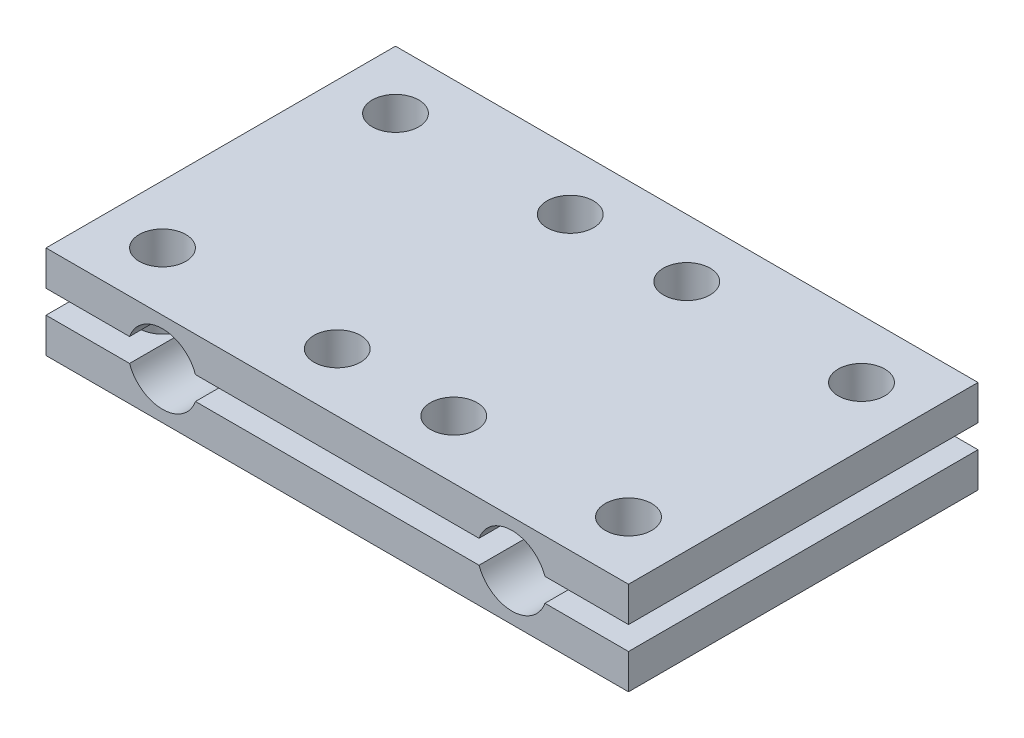
ISO-10303-21;
HEADER;
FILE_DESCRIPTION(('STEP AP214'),'2;1');
FILE_NAME('part.step','',(''),(''),'','','');
FILE_SCHEMA(('AUTOMOTIVE_DESIGN { 1 0 10303 214 1 1 1 1 }'));
ENDSEC;
DATA;
#1=APPLICATION_CONTEXT('core data for automotive mechanical design processes');
#2=APPLICATION_PROTOCOL_DEFINITION('international standard','automotive_design',2000,#1);
#3=PRODUCT_CONTEXT('',#1,'mechanical');
#4=PRODUCT('Part','Part','',(#3));
#5=PRODUCT_RELATED_PRODUCT_CATEGORY('part','',(#4));
#6=PRODUCT_DEFINITION_FORMATION('','',#4);
#7=PRODUCT_DEFINITION_CONTEXT('part definition',#1,'design');
#8=PRODUCT_DEFINITION('design','',#6,#7);
#9=PRODUCT_DEFINITION_SHAPE('','',#8);
#10=(LENGTH_UNIT() NAMED_UNIT(*) SI_UNIT(.MILLI.,.METRE.));
#11=(NAMED_UNIT(*) PLANE_ANGLE_UNIT() SI_UNIT($,.RADIAN.));
#12=(NAMED_UNIT(*) SI_UNIT($,.STERADIAN.) SOLID_ANGLE_UNIT());
#13=UNCERTAINTY_MEASURE_WITH_UNIT(LENGTH_MEASURE(1.E-05),#10,'distance_accuracy_value','');
#14=(GEOMETRIC_REPRESENTATION_CONTEXT(3) GLOBAL_UNCERTAINTY_ASSIGNED_CONTEXT((#13)) GLOBAL_UNIT_ASSIGNED_CONTEXT((#10,
#11,#12)) REPRESENTATION_CONTEXT('',''));
#15=CARTESIAN_POINT('',(0.,0.,0.));
#16=DIRECTION('',(0.,0.,1.));
#17=DIRECTION('',(1.,0.,0.));
#18=AXIS2_PLACEMENT_3D('',#15,#16,#17);
#19=CARTESIAN_POINT('',(-25.,8.,0.));
#20=DIRECTION('',(-1.,0.,0.));
#21=DIRECTION('',(0.,0.,1.));
#22=AXIS2_PLACEMENT_3D('',#19,#20,#21);
#23=PLANE('',#22);
#24=DIRECTION('',(0.,0.,1.));
#25=VECTOR('',#24,1.);
#26=CARTESIAN_POINT('',(-25.,3.,-30.));
#27=LINE('',#26,#25);
#28=CARTESIAN_POINT('',(-25.,3.,-30.));
#29=VERTEX_POINT('',#28);
#30=CARTESIAN_POINT('',(-25.,3.,0.));
#31=VERTEX_POINT('',#30);
#32=EDGE_CURVE('E227',#29,#31,#27,.T.);
#33=ORIENTED_EDGE('',*,*,#32,.F.);
#34=DIRECTION('',(0.,-1.,0.));
#35=VECTOR('',#34,1.);
#36=CARTESIAN_POINT('',(-25.,8.,-30.));
#37=LINE('',#36,#35);
#38=CARTESIAN_POINT('',(-25.,0.,-30.));
#39=VERTEX_POINT('',#38);
#40=EDGE_CURVE('E209',#29,#39,#37,.T.);
#41=ORIENTED_EDGE('',*,*,#40,.T.);
#42=DIRECTION('',(0.,0.,-1.));
#43=VECTOR('',#42,1.);
#44=CARTESIAN_POINT('',(-25.,0.,0.));
#45=LINE('',#44,#43);
#46=CARTESIAN_POINT('',(-25.,0.,0.));
#47=VERTEX_POINT('',#46);
#48=EDGE_CURVE('E264',#47,#39,#45,.T.);
#49=ORIENTED_EDGE('',*,*,#48,.F.);
#50=DIRECTION('',(0.,-1.,0.));
#51=VECTOR('',#50,1.);
#52=CARTESIAN_POINT('',(-25.,8.,0.));
#53=LINE('',#52,#51);
#54=EDGE_CURVE('E199',#31,#47,#53,.T.);
#55=ORIENTED_EDGE('',*,*,#54,.F.);
#56=EDGE_LOOP('',(#33,#41,#49,#55));
#57=FACE_BOUND('',#56,.T.);
#58=ADVANCED_FACE('F104',(#57),#23,.T.);
#59=CARTESIAN_POINT('',(0.,8.,0.));
#60=DIRECTION('',(0.,0.,1.));
#61=DIRECTION('',(1.,0.,0.));
#62=AXIS2_PLACEMENT_3D('',#59,#60,#61);
#63=PLANE('',#62);
#64=DIRECTION('',(1.,0.,0.));
#65=VECTOR('',#64,1.);
#66=CARTESIAN_POINT('',(0.,3.,0.));
#67=LINE('',#66,#65);
#68=CARTESIAN_POINT('',(17.8284271247462,3.,0.));
#69=VERTEX_POINT('',#68);
#70=CARTESIAN_POINT('',(25.,3.,0.));
#71=VERTEX_POINT('',#70);
#72=EDGE_CURVE('E220',#69,#71,#67,.T.);
#73=ORIENTED_EDGE('',*,*,#72,.F.);
#74=CARTESIAN_POINT('',(15.,4.00000000000001,0.));
#75=DIRECTION('',(0.,0.,-1.));
#76=DIRECTION('',(-1.,0.,0.));
#77=AXIS2_PLACEMENT_3D('',#74,#75,#76);
#78=CIRCLE('',#77,3.);
#79=CARTESIAN_POINT('',(12.1715728752538,3.,0.));
#80=VERTEX_POINT('',#79);
#81=EDGE_CURVE('E108',#69,#80,#78,.T.);
#82=ORIENTED_EDGE('',*,*,#81,.T.);
#83=DIRECTION('',(1.,0.,0.));
#84=VECTOR('',#83,1.);
#85=CARTESIAN_POINT('',(0.,3.,0.));
#86=LINE('',#85,#84);
#87=CARTESIAN_POINT('',(-12.1715728752538,3.,0.));
#88=VERTEX_POINT('',#87);
#89=EDGE_CURVE('E178',#88,#80,#86,.T.);
#90=ORIENTED_EDGE('',*,*,#89,.F.);
#91=CARTESIAN_POINT('',(-15.,4.,0.));
#92=DIRECTION('',(0.,0.,1.));
#93=DIRECTION('',(1.,0.,0.));
#94=AXIS2_PLACEMENT_3D('',#91,#92,#93);
#95=CIRCLE('',#94,3.);
#96=CARTESIAN_POINT('',(-17.8284271247462,3.,0.));
#97=VERTEX_POINT('',#96);
#98=EDGE_CURVE('E13',#97,#88,#95,.T.);
#99=ORIENTED_EDGE('',*,*,#98,.F.);
#100=DIRECTION('',(1.,0.,0.));
#101=VECTOR('',#100,1.);
#102=CARTESIAN_POINT('',(0.,3.,0.));
#103=LINE('',#102,#101);
#104=EDGE_CURVE('E234',#31,#97,#103,.T.);
#105=ORIENTED_EDGE('',*,*,#104,.F.);
#106=ORIENTED_EDGE('',*,*,#54,.T.);
#107=DIRECTION('',(-1.,0.,0.));
#108=VECTOR('',#107,1.);
#109=CARTESIAN_POINT('',(0.,0.,0.));
#110=LINE('',#109,#108);
#111=CARTESIAN_POINT('',(25.,0.,0.));
#112=VERTEX_POINT('',#111);
#113=EDGE_CURVE('E268',#112,#47,#110,.T.);
#114=ORIENTED_EDGE('',*,*,#113,.F.);
#115=DIRECTION('',(0.,-1.,0.));
#116=VECTOR('',#115,1.);
#117=CARTESIAN_POINT('',(25.,8.,0.));
#118=LINE('',#117,#116);
#119=EDGE_CURVE('E202',#71,#112,#118,.T.);
#120=ORIENTED_EDGE('',*,*,#119,.F.);
#121=EDGE_LOOP('',(#73,#82,#90,#99,#105,#106,#114,#120));
#122=FACE_BOUND('',#121,.T.);
#123=ADVANCED_FACE('F217',(#122),#63,.T.);
#124=CARTESIAN_POINT('',(25.,8.,0.));
#125=DIRECTION('',(-1.,0.,0.));
#126=DIRECTION('',(0.,0.,1.));
#127=AXIS2_PLACEMENT_3D('',#124,#125,#126);
#128=PLANE('',#127);
#129=DIRECTION('',(0.,-1.,0.));
#130=VECTOR('',#129,1.);
#131=CARTESIAN_POINT('',(25.,8.,-30.));
#132=LINE('',#131,#130);
#133=CARTESIAN_POINT('',(25.,3.,-30.));
#134=VERTEX_POINT('',#133);
#135=CARTESIAN_POINT('',(25.,0.,-30.));
#136=VERTEX_POINT('',#135);
#137=EDGE_CURVE('E205',#134,#136,#132,.T.);
#138=ORIENTED_EDGE('',*,*,#137,.F.);
#139=DIRECTION('',(0.,0.,1.));
#140=VECTOR('',#139,1.);
#141=CARTESIAN_POINT('',(25.,3.,-30.));
#142=LINE('',#141,#140);
#143=EDGE_CURVE('E201',#134,#71,#142,.T.);
#144=ORIENTED_EDGE('',*,*,#143,.T.);
#145=ORIENTED_EDGE('',*,*,#119,.T.);
#146=DIRECTION('',(0.,0.,-1.));
#147=VECTOR('',#146,1.);
#148=CARTESIAN_POINT('',(25.,0.,0.));
#149=LINE('',#148,#147);
#150=EDGE_CURVE('E204',#112,#136,#149,.T.);
#151=ORIENTED_EDGE('',*,*,#150,.T.);
#152=EDGE_LOOP('',(#138,#144,#145,#151));
#153=FACE_BOUND('',#152,.T.);
#154=ADVANCED_FACE('F312',(#153),#128,.F.);
#155=CARTESIAN_POINT('',(20.,8.,-5.));
#156=DIRECTION('',(0.,-1.,0.));
#157=DIRECTION('',(0.,0.,-1.));
#158=AXIS2_PLACEMENT_3D('',#155,#156,#157);
#159=CYLINDRICAL_SURFACE('',#158,2.);
#160=CARTESIAN_POINT('',(20.,3.,-5.));
#161=DIRECTION('',(0.,-1.,0.));
#162=DIRECTION('',(0.,0.,-1.));
#163=AXIS2_PLACEMENT_3D('',#160,#161,#162);
#164=CIRCLE('',#163,2.);
#165=CARTESIAN_POINT('',(20.,3.,-7.));
#166=VERTEX_POINT('',#165);
#167=EDGE_CURVE('E223',#166,#166,#164,.T.);
#168=ORIENTED_EDGE('',*,*,#167,.F.);
#169=EDGE_LOOP('',(#168));
#170=FACE_BOUND('',#169,.T.);
#171=CARTESIAN_POINT('',(20.,0.,-5.));
#172=DIRECTION('',(0.,1.,0.));
#173=DIRECTION('',(0.,0.,1.));
#174=AXIS2_PLACEMENT_3D('',#171,#172,#173);
#175=CIRCLE('',#174,2.);
#176=CARTESIAN_POINT('',(20.,0.,-2.99999999999999));
#177=VERTEX_POINT('',#176);
#178=EDGE_CURVE('E248',#177,#177,#175,.T.);
#179=ORIENTED_EDGE('',*,*,#178,.F.);
#180=EDGE_LOOP('',(#179));
#181=FACE_BOUND('',#180,.T.);
#182=ADVANCED_FACE('F340',(#170,#181),#159,.F.);
#183=CARTESIAN_POINT('',(5.,8.,-25.));
#184=DIRECTION('',(0.,-1.,0.));
#185=DIRECTION('',(0.,0.,-1.));
#186=AXIS2_PLACEMENT_3D('',#183,#184,#185);
#187=CYLINDRICAL_SURFACE('',#186,2.);
#188=CARTESIAN_POINT('',(5.,3.,-25.));
#189=DIRECTION('',(0.,-1.,0.));
#190=DIRECTION('',(0.,0.,-1.));
#191=AXIS2_PLACEMENT_3D('',#188,#189,#190);
#192=CIRCLE('',#191,2.);
#193=CARTESIAN_POINT('',(5.,3.,-27.));
#194=VERTEX_POINT('',#193);
#195=EDGE_CURVE('E243',#194,#194,#192,.T.);
#196=ORIENTED_EDGE('',*,*,#195,.F.);
#197=EDGE_LOOP('',(#196));
#198=FACE_BOUND('',#197,.T.);
#199=CARTESIAN_POINT('',(5.,0.,-25.));
#200=DIRECTION('',(0.,1.,0.));
#201=DIRECTION('',(0.,0.,1.));
#202=AXIS2_PLACEMENT_3D('',#199,#200,#201);
#203=CIRCLE('',#202,2.);
#204=CARTESIAN_POINT('',(5.,0.,-23.));
#205=VERTEX_POINT('',#204);
#206=EDGE_CURVE('E277',#205,#205,#203,.T.);
#207=ORIENTED_EDGE('',*,*,#206,.F.);
#208=EDGE_LOOP('',(#207));
#209=FACE_BOUND('',#208,.T.);
#210=ADVANCED_FACE('F344',(#198,#209),#187,.F.);
#211=CARTESIAN_POINT('',(5.,8.,-5.));
#212=DIRECTION('',(0.,-1.,0.));
#213=DIRECTION('',(0.,0.,-1.));
#214=AXIS2_PLACEMENT_3D('',#211,#212,#213);
#215=CYLINDRICAL_SURFACE('',#214,2.);
#216=CARTESIAN_POINT('',(5.,3.,-5.));
#217=DIRECTION('',(0.,-1.,0.));
#218=DIRECTION('',(0.,0.,-1.));
#219=AXIS2_PLACEMENT_3D('',#216,#217,#218);
#220=CIRCLE('',#219,2.);
#221=CARTESIAN_POINT('',(5.,3.,-7.));
#222=VERTEX_POINT('',#221);
#223=EDGE_CURVE('E255',#222,#222,#220,.F.);
#224=ORIENTED_EDGE('',*,*,#223,.T.);
#225=EDGE_LOOP('',(#224));
#226=FACE_BOUND('',#225,.T.);
#227=CARTESIAN_POINT('',(5.,0.,-5.));
#228=DIRECTION('',(0.,1.,0.));
#229=DIRECTION('',(0.,0.,1.));
#230=AXIS2_PLACEMENT_3D('',#227,#228,#229);
#231=CIRCLE('',#230,2.);
#232=CARTESIAN_POINT('',(5.,0.,-3.));
#233=VERTEX_POINT('',#232);
#234=EDGE_CURVE('E254',#233,#233,#231,.F.);
#235=ORIENTED_EDGE('',*,*,#234,.T.);
#236=EDGE_LOOP('',(#235));
#237=FACE_BOUND('',#236,.T.);
#238=ADVANCED_FACE('F357',(#226,#237),#215,.F.);
#239=CARTESIAN_POINT('',(-5.,8.,-25.));
#240=DIRECTION('',(0.,-1.,0.));
#241=DIRECTION('',(0.,0.,-1.));
#242=AXIS2_PLACEMENT_3D('',#239,#240,#241);
#243=CYLINDRICAL_SURFACE('',#242,2.);
#244=CARTESIAN_POINT('',(-5.,3.,-25.));
#245=DIRECTION('',(0.,-1.,0.));
#246=DIRECTION('',(0.,0.,-1.));
#247=AXIS2_PLACEMENT_3D('',#244,#245,#246);
#248=CIRCLE('',#247,2.);
#249=CARTESIAN_POINT('',(-5.,3.,-27.));
#250=VERTEX_POINT('',#249);
#251=EDGE_CURVE('E251',#250,#250,#248,.F.);
#252=ORIENTED_EDGE('',*,*,#251,.T.);
#253=EDGE_LOOP('',(#252));
#254=FACE_BOUND('',#253,.T.);
#255=CARTESIAN_POINT('',(-5.,0.,-25.));
#256=DIRECTION('',(0.,1.,0.));
#257=DIRECTION('',(0.,0.,1.));
#258=AXIS2_PLACEMENT_3D('',#255,#256,#257);
#259=CIRCLE('',#258,2.);
#260=CARTESIAN_POINT('',(-5.,0.,-23.));
#261=VERTEX_POINT('',#260);
#262=EDGE_CURVE('E232',#261,#261,#259,.F.);
#263=ORIENTED_EDGE('',*,*,#262,.T.);
#264=EDGE_LOOP('',(#263));
#265=FACE_BOUND('',#264,.T.);
#266=ADVANCED_FACE('F353',(#254,#265),#243,.F.);
#267=CARTESIAN_POINT('',(-5.,8.,-5.));
#268=DIRECTION('',(0.,-1.,0.));
#269=DIRECTION('',(0.,0.,-1.));
#270=AXIS2_PLACEMENT_3D('',#267,#268,#269);
#271=CYLINDRICAL_SURFACE('',#270,2.);
#272=CARTESIAN_POINT('',(-5.,3.,-5.));
#273=DIRECTION('',(0.,-1.,0.));
#274=DIRECTION('',(0.,0.,-1.));
#275=AXIS2_PLACEMENT_3D('',#272,#273,#274);
#276=CIRCLE('',#275,2.);
#277=CARTESIAN_POINT('',(-5.,3.,-7.));
#278=VERTEX_POINT('',#277);
#279=EDGE_CURVE('E241',#278,#278,#276,.T.);
#280=ORIENTED_EDGE('',*,*,#279,.F.);
#281=EDGE_LOOP('',(#280));
#282=FACE_BOUND('',#281,.T.);
#283=CARTESIAN_POINT('',(-5.,0.,-5.));
#284=DIRECTION('',(0.,1.,0.));
#285=DIRECTION('',(0.,0.,1.));
#286=AXIS2_PLACEMENT_3D('',#283,#284,#285);
#287=CIRCLE('',#286,2.);
#288=CARTESIAN_POINT('',(-5.,0.,-3.));
#289=VERTEX_POINT('',#288);
#290=EDGE_CURVE('E271',#289,#289,#287,.T.);
#291=ORIENTED_EDGE('',*,*,#290,.F.);
#292=EDGE_LOOP('',(#291));
#293=FACE_BOUND('',#292,.T.);
#294=ADVANCED_FACE('F350',(#282,#293),#271,.F.);
#295=CARTESIAN_POINT('',(0.,8.,-30.));
#296=DIRECTION('',(0.,0.,1.));
#297=DIRECTION('',(1.,0.,0.));
#298=AXIS2_PLACEMENT_3D('',#295,#296,#297);
#299=PLANE('',#298);
#300=CARTESIAN_POINT('',(15.,4.00000000000001,-30.));
#301=DIRECTION('',(0.,0.,-1.));
#302=DIRECTION('',(-1.,0.,0.));
#303=AXIS2_PLACEMENT_3D('',#300,#301,#302);
#304=CIRCLE('',#303,3.);
#305=CARTESIAN_POINT('',(17.8284271247462,3.,-30.));
#306=VERTEX_POINT('',#305);
#307=CARTESIAN_POINT('',(12.1715728752538,3.,-30.));
#308=VERTEX_POINT('',#307);
#309=EDGE_CURVE('E180',#306,#308,#304,.T.);
#310=ORIENTED_EDGE('',*,*,#309,.F.);
#311=DIRECTION('',(1.,0.,0.));
#312=VECTOR('',#311,1.);
#313=CARTESIAN_POINT('',(0.,3.,-30.));
#314=LINE('',#313,#312);
#315=EDGE_CURVE('E208',#306,#134,#314,.T.);
#316=ORIENTED_EDGE('',*,*,#315,.T.);
#317=ORIENTED_EDGE('',*,*,#137,.T.);
#318=DIRECTION('',(-1.,0.,0.));
#319=VECTOR('',#318,1.);
#320=CARTESIAN_POINT('',(0.,0.,-30.));
#321=LINE('',#320,#319);
#322=EDGE_CURVE('E207',#136,#39,#321,.T.);
#323=ORIENTED_EDGE('',*,*,#322,.T.);
#324=ORIENTED_EDGE('',*,*,#40,.F.);
#325=DIRECTION('',(1.,0.,0.));
#326=VECTOR('',#325,1.);
#327=CARTESIAN_POINT('',(0.,3.,-30.));
#328=LINE('',#327,#326);
#329=CARTESIAN_POINT('',(-17.8284271247462,3.,-30.));
#330=VERTEX_POINT('',#329);
#331=EDGE_CURVE('E194',#29,#330,#328,.T.);
#332=ORIENTED_EDGE('',*,*,#331,.T.);
#333=CARTESIAN_POINT('',(-15.,4.,-30.));
#334=DIRECTION('',(0.,0.,1.));
#335=DIRECTION('',(1.,0.,0.));
#336=AXIS2_PLACEMENT_3D('',#333,#334,#335);
#337=CIRCLE('',#336,3.);
#338=CARTESIAN_POINT('',(-12.1715728752538,3.,-30.));
#339=VERTEX_POINT('',#338);
#340=EDGE_CURVE('E188',#330,#339,#337,.T.);
#341=ORIENTED_EDGE('',*,*,#340,.T.);
#342=DIRECTION('',(1.,0.,0.));
#343=VECTOR('',#342,1.);
#344=CARTESIAN_POINT('',(0.,3.,-30.));
#345=LINE('',#344,#343);
#346=EDGE_CURVE('E173',#339,#308,#345,.T.);
#347=ORIENTED_EDGE('',*,*,#346,.T.);
#348=EDGE_LOOP('',(#310,#316,#317,#323,#324,#332,#341,#347));
#349=FACE_BOUND('',#348,.T.);
#350=ADVANCED_FACE('F186',(#349),#299,.F.);
#351=CARTESIAN_POINT('',(-20.,8.,-25.));
#352=DIRECTION('',(0.,-1.,0.));
#353=DIRECTION('',(0.,0.,-1.));
#354=AXIS2_PLACEMENT_3D('',#351,#352,#353);
#355=CYLINDRICAL_SURFACE('',#354,2.00000000000001);
#356=CARTESIAN_POINT('',(-20.,3.,-25.));
#357=DIRECTION('',(0.,-1.,0.));
#358=DIRECTION('',(0.,0.,-1.));
#359=AXIS2_PLACEMENT_3D('',#356,#357,#358);
#360=CIRCLE('',#359,2.00000000000001);
#361=CARTESIAN_POINT('',(-20.,3.,-27.));
#362=VERTEX_POINT('',#361);
#363=EDGE_CURVE('E237',#362,#362,#360,.T.);
#364=ORIENTED_EDGE('',*,*,#363,.F.);
#365=EDGE_LOOP('',(#364));
#366=FACE_BOUND('',#365,.T.);
#367=CARTESIAN_POINT('',(-20.,0.,-25.));
#368=DIRECTION('',(0.,1.,0.));
#369=DIRECTION('',(0.,0.,1.));
#370=AXIS2_PLACEMENT_3D('',#367,#368,#369);
#371=CIRCLE('',#370,2.00000000000001);
#372=CARTESIAN_POINT('',(-20.,0.,-23.));
#373=VERTEX_POINT('',#372);
#374=EDGE_CURVE('E261',#373,#373,#371,.T.);
#375=ORIENTED_EDGE('',*,*,#374,.F.);
#376=EDGE_LOOP('',(#375));
#377=FACE_BOUND('',#376,.T.);
#378=ADVANCED_FACE('F316',(#366,#377),#355,.F.);
#379=CARTESIAN_POINT('',(-20.,8.,-5.));
#380=DIRECTION('',(0.,-1.,0.));
#381=DIRECTION('',(0.,0.,-1.));
#382=AXIS2_PLACEMENT_3D('',#379,#380,#381);
#383=CYLINDRICAL_SURFACE('',#382,2.);
#384=CARTESIAN_POINT('',(-20.,3.,-5.));
#385=DIRECTION('',(0.,-1.,0.));
#386=DIRECTION('',(0.,0.,-1.));
#387=AXIS2_PLACEMENT_3D('',#384,#385,#386);
#388=CIRCLE('',#387,2.);
#389=CARTESIAN_POINT('',(-20.,3.,-7.));
#390=VERTEX_POINT('',#389);
#391=EDGE_CURVE('E189',#390,#390,#388,.F.);
#392=ORIENTED_EDGE('',*,*,#391,.T.);
#393=EDGE_LOOP('',(#392));
#394=FACE_BOUND('',#393,.T.);
#395=CARTESIAN_POINT('',(-20.,0.,-5.));
#396=DIRECTION('',(0.,1.,0.));
#397=DIRECTION('',(0.,0.,1.));
#398=AXIS2_PLACEMENT_3D('',#395,#396,#397);
#399=CIRCLE('',#398,2.);
#400=CARTESIAN_POINT('',(-20.,0.,-2.99999999999999));
#401=VERTEX_POINT('',#400);
#402=EDGE_CURVE('E192',#401,#401,#399,.F.);
#403=ORIENTED_EDGE('',*,*,#402,.T.);
#404=EDGE_LOOP('',(#403));
#405=FACE_BOUND('',#404,.T.);
#406=ADVANCED_FACE('F319',(#394,#405),#383,.F.);
#407=CARTESIAN_POINT('',(20.,8.,-25.));
#408=DIRECTION('',(0.,-1.,0.));
#409=DIRECTION('',(0.,0.,-1.));
#410=AXIS2_PLACEMENT_3D('',#407,#408,#409);
#411=CYLINDRICAL_SURFACE('',#410,2.00000000000001);
#412=CARTESIAN_POINT('',(20.,3.,-25.));
#413=DIRECTION('',(0.,-1.,0.));
#414=DIRECTION('',(0.,0.,-1.));
#415=AXIS2_PLACEMENT_3D('',#412,#413,#414);
#416=CIRCLE('',#415,2.00000000000001);
#417=CARTESIAN_POINT('',(20.,3.,-27.));
#418=VERTEX_POINT('',#417);
#419=EDGE_CURVE('E260',#418,#418,#416,.F.);
#420=ORIENTED_EDGE('',*,*,#419,.T.);
#421=EDGE_LOOP('',(#420));
#422=FACE_BOUND('',#421,.T.);
#423=CARTESIAN_POINT('',(20.,0.,-25.));
#424=DIRECTION('',(0.,1.,0.));
#425=DIRECTION('',(0.,0.,1.));
#426=AXIS2_PLACEMENT_3D('',#423,#424,#425);
#427=CIRCLE('',#426,2.00000000000001);
#428=CARTESIAN_POINT('',(20.,0.,-23.));
#429=VERTEX_POINT('',#428);
#430=EDGE_CURVE('E265',#429,#429,#427,.F.);
#431=ORIENTED_EDGE('',*,*,#430,.T.);
#432=EDGE_LOOP('',(#431));
#433=FACE_BOUND('',#432,.T.);
#434=ADVANCED_FACE('F291',(#422,#433),#411,.F.);
#435=CARTESIAN_POINT('',(0.,0.,0.));
#436=DIRECTION('',(0.,1.,0.));
#437=DIRECTION('',(0.,0.,1.));
#438=AXIS2_PLACEMENT_3D('',#435,#436,#437);
#439=PLANE('',#438);
#440=ORIENTED_EDGE('',*,*,#402,.F.);
#441=EDGE_LOOP('',(#440));
#442=FACE_BOUND('',#441,.T.);
#443=ORIENTED_EDGE('',*,*,#374,.T.);
#444=EDGE_LOOP('',(#443));
#445=FACE_BOUND('',#444,.T.);
#446=ORIENTED_EDGE('',*,*,#48,.T.);
#447=ORIENTED_EDGE('',*,*,#322,.F.);
#448=ORIENTED_EDGE('',*,*,#150,.F.);
#449=ORIENTED_EDGE('',*,*,#113,.T.);
#450=EDGE_LOOP('',(#446,#447,#448,#449));
#451=FACE_BOUND('',#450,.T.);
#452=ORIENTED_EDGE('',*,*,#290,.T.);
#453=EDGE_LOOP('',(#452));
#454=FACE_BOUND('',#453,.T.);
#455=ORIENTED_EDGE('',*,*,#262,.F.);
#456=EDGE_LOOP('',(#455));
#457=FACE_BOUND('',#456,.T.);
#458=ORIENTED_EDGE('',*,*,#234,.F.);
#459=EDGE_LOOP('',(#458));
#460=FACE_BOUND('',#459,.T.);
#461=ORIENTED_EDGE('',*,*,#206,.T.);
#462=EDGE_LOOP('',(#461));
#463=FACE_BOUND('',#462,.T.);
#464=ORIENTED_EDGE('',*,*,#178,.T.);
#465=EDGE_LOOP('',(#464));
#466=FACE_BOUND('',#465,.T.);
#467=ORIENTED_EDGE('',*,*,#430,.F.);
#468=EDGE_LOOP('',(#467));
#469=FACE_BOUND('',#468,.T.);
#470=ADVANCED_FACE('F325',(#442,#445,#451,#454,#457,#460,#463,#466,#469),#439,.F.);
#471=CARTESIAN_POINT('',(0.,3.,-30.));
#472=DIRECTION('',(0.,-1.,0.));
#473=DIRECTION('',(0.,0.,-1.));
#474=AXIS2_PLACEMENT_3D('',#471,#472,#473);
#475=PLANE('',#474);
#476=ORIENTED_EDGE('',*,*,#195,.T.);
#477=EDGE_LOOP('',(#476));
#478=FACE_BOUND('',#477,.T.);
#479=ORIENTED_EDGE('',*,*,#251,.F.);
#480=EDGE_LOOP('',(#479));
#481=FACE_BOUND('',#480,.T.);
#482=ORIENTED_EDGE('',*,*,#279,.T.);
#483=EDGE_LOOP('',(#482));
#484=FACE_BOUND('',#483,.T.);
#485=ORIENTED_EDGE('',*,*,#89,.T.);
#486=DIRECTION('',(0.,0.,1.));
#487=VECTOR('',#486,1.);
#488=CARTESIAN_POINT('',(12.1715728752538,3.,-30.));
#489=LINE('',#488,#487);
#490=EDGE_CURVE('E146',#308,#80,#489,.T.);
#491=ORIENTED_EDGE('',*,*,#490,.F.);
#492=ORIENTED_EDGE('',*,*,#346,.F.);
#493=DIRECTION('',(0.,0.,1.));
#494=VECTOR('',#493,1.);
#495=CARTESIAN_POINT('',(-12.1715728752538,3.,-30.));
#496=LINE('',#495,#494);
#497=EDGE_CURVE('E238',#339,#88,#496,.T.);
#498=ORIENTED_EDGE('',*,*,#497,.T.);
#499=EDGE_LOOP('',(#485,#491,#492,#498));
#500=FACE_BOUND('',#499,.T.);
#501=ORIENTED_EDGE('',*,*,#223,.F.);
#502=EDGE_LOOP('',(#501));
#503=FACE_BOUND('',#502,.T.);
#504=ADVANCED_FACE('F175',(#478,#481,#484,#500,#503),#475,.F.);
#505=CARTESIAN_POINT('',(0.,3.,-30.));
#506=DIRECTION('',(0.,-1.,0.));
#507=DIRECTION('',(0.,0.,-1.));
#508=AXIS2_PLACEMENT_3D('',#505,#506,#507);
#509=PLANE('',#508);
#510=ORIENTED_EDGE('',*,*,#363,.T.);
#511=EDGE_LOOP('',(#510));
#512=FACE_BOUND('',#511,.T.);
#513=ORIENTED_EDGE('',*,*,#104,.T.);
#514=DIRECTION('',(0.,0.,1.));
#515=VECTOR('',#514,1.);
#516=CARTESIAN_POINT('',(-17.8284271247462,3.,-30.));
#517=LINE('',#516,#515);
#518=EDGE_CURVE('E114',#330,#97,#517,.T.);
#519=ORIENTED_EDGE('',*,*,#518,.F.);
#520=ORIENTED_EDGE('',*,*,#331,.F.);
#521=ORIENTED_EDGE('',*,*,#32,.T.);
#522=EDGE_LOOP('',(#513,#519,#520,#521));
#523=FACE_BOUND('',#522,.T.);
#524=ORIENTED_EDGE('',*,*,#391,.F.);
#525=EDGE_LOOP('',(#524));
#526=FACE_BOUND('',#525,.T.);
#527=ADVANCED_FACE('F296',(#512,#523,#526),#509,.F.);
#528=CARTESIAN_POINT('',(0.,3.,-30.));
#529=DIRECTION('',(0.,-1.,0.));
#530=DIRECTION('',(0.,0.,-1.));
#531=AXIS2_PLACEMENT_3D('',#528,#529,#530);
#532=PLANE('',#531);
#533=ORIENTED_EDGE('',*,*,#167,.T.);
#534=EDGE_LOOP('',(#533));
#535=FACE_BOUND('',#534,.T.);
#536=ORIENTED_EDGE('',*,*,#72,.T.);
#537=ORIENTED_EDGE('',*,*,#143,.F.);
#538=ORIENTED_EDGE('',*,*,#315,.F.);
#539=DIRECTION('',(0.,0.,1.));
#540=VECTOR('',#539,1.);
#541=CARTESIAN_POINT('',(17.8284271247462,3.,-30.));
#542=LINE('',#541,#540);
#543=EDGE_CURVE('E154',#306,#69,#542,.T.);
#544=ORIENTED_EDGE('',*,*,#543,.T.);
#545=EDGE_LOOP('',(#536,#537,#538,#544));
#546=FACE_BOUND('',#545,.T.);
#547=ORIENTED_EDGE('',*,*,#419,.F.);
#548=EDGE_LOOP('',(#547));
#549=FACE_BOUND('',#548,.T.);
#550=ADVANCED_FACE('F294',(#535,#546,#549),#532,.F.);
#551=CARTESIAN_POINT('',(15.,4.00000000000001,-30.));
#552=DIRECTION('',(0.,0.,1.));
#553=DIRECTION('',(1.,0.,0.));
#554=AXIS2_PLACEMENT_3D('',#551,#552,#553);
#555=CYLINDRICAL_SURFACE('',#554,3.);
#556=ORIENTED_EDGE('',*,*,#490,.T.);
#557=ORIENTED_EDGE('',*,*,#81,.F.);
#558=ORIENTED_EDGE('',*,*,#543,.F.);
#559=ORIENTED_EDGE('',*,*,#309,.T.);
#560=EDGE_LOOP('',(#556,#557,#558,#559));
#561=FACE_BOUND('',#560,.T.);
#562=ADVANCED_FACE('F106',(#561),#555,.F.);
#563=CARTESIAN_POINT('',(-15.,4.,-30.));
#564=DIRECTION('',(0.,0.,1.));
#565=DIRECTION('',(1.,0.,0.));
#566=AXIS2_PLACEMENT_3D('',#563,#564,#565);
#567=CYLINDRICAL_SURFACE('',#566,3.);
#568=ORIENTED_EDGE('',*,*,#340,.F.);
#569=ORIENTED_EDGE('',*,*,#518,.T.);
#570=ORIENTED_EDGE('',*,*,#98,.T.);
#571=ORIENTED_EDGE('',*,*,#497,.F.);
#572=EDGE_LOOP('',(#568,#569,#570,#571));
#573=FACE_BOUND('',#572,.T.);
#574=ADVANCED_FACE('F303',(#573),#567,.F.);
#575=CLOSED_SHELL('',(#58,#123,#154,#182,#210,#238,#266,#294,#350,#378,#406,#434,#470,#504,#527,
#550,#562,#574));
#576=MANIFOLD_SOLID_BREP('B2',#575);
#577=CARTESIAN_POINT('',(20.,8.,-5.));
#578=DIRECTION('',(0.,-1.,0.));
#579=DIRECTION('',(0.,0.,-1.));
#580=AXIS2_PLACEMENT_3D('',#577,#578,#579);
#581=CYLINDRICAL_SURFACE('',#580,2.);
#582=CARTESIAN_POINT('',(20.,8.,-5.));
#583=DIRECTION('',(0.,1.,0.));
#584=DIRECTION('',(0.,0.,1.));
#585=AXIS2_PLACEMENT_3D('',#582,#583,#584);
#586=CIRCLE('',#585,2.);
#587=CARTESIAN_POINT('',(20.,8.,-2.99999999999999));
#588=VERTEX_POINT('',#587);
#589=EDGE_CURVE('E655',#588,#588,#586,.T.);
#590=ORIENTED_EDGE('',*,*,#589,.T.);
#591=EDGE_LOOP('',(#590));
#592=FACE_BOUND('',#591,.T.);
#593=CARTESIAN_POINT('',(20.,5.,-5.));
#594=DIRECTION('',(0.,-1.,0.));
#595=DIRECTION('',(0.,0.,-1.));
#596=AXIS2_PLACEMENT_3D('',#593,#594,#595);
#597=CIRCLE('',#596,2.);
#598=CARTESIAN_POINT('',(20.,5.,-7.));
#599=VERTEX_POINT('',#598);
#600=EDGE_CURVE('E609',#599,#599,#597,.T.);
#601=ORIENTED_EDGE('',*,*,#600,.T.);
#602=EDGE_LOOP('',(#601));
#603=FACE_BOUND('',#602,.T.);
#604=ADVANCED_FACE('F508',(#592,#603),#581,.F.);
#605=CARTESIAN_POINT('',(5.,8.,-25.));
#606=DIRECTION('',(0.,-1.,0.));
#607=DIRECTION('',(0.,0.,-1.));
#608=AXIS2_PLACEMENT_3D('',#605,#606,#607);
#609=CYLINDRICAL_SURFACE('',#608,2.);
#610=CARTESIAN_POINT('',(5.,8.,-25.));
#611=DIRECTION('',(0.,1.,0.));
#612=DIRECTION('',(0.,0.,1.));
#613=AXIS2_PLACEMENT_3D('',#610,#611,#612);
#614=CIRCLE('',#613,2.);
#615=CARTESIAN_POINT('',(5.,8.,-23.));
#616=VERTEX_POINT('',#615);
#617=EDGE_CURVE('E652',#616,#616,#614,.T.);
#618=ORIENTED_EDGE('',*,*,#617,.T.);
#619=EDGE_LOOP('',(#618));
#620=FACE_BOUND('',#619,.T.);
#621=CARTESIAN_POINT('',(5.,5.,-25.));
#622=DIRECTION('',(0.,-1.,0.));
#623=DIRECTION('',(0.,0.,-1.));
#624=AXIS2_PLACEMENT_3D('',#621,#622,#623);
#625=CIRCLE('',#624,2.);
#626=CARTESIAN_POINT('',(5.,5.,-27.));
#627=VERTEX_POINT('',#626);
#628=EDGE_CURVE('E625',#627,#627,#625,.T.);
#629=ORIENTED_EDGE('',*,*,#628,.T.);
#630=EDGE_LOOP('',(#629));
#631=FACE_BOUND('',#630,.T.);
#632=ADVANCED_FACE('F721',(#620,#631),#609,.F.);
#633=CARTESIAN_POINT('',(5.,8.,-5.));
#634=DIRECTION('',(0.,-1.,0.));
#635=DIRECTION('',(0.,0.,-1.));
#636=AXIS2_PLACEMENT_3D('',#633,#634,#635);
#637=CYLINDRICAL_SURFACE('',#636,2.);
#638=CARTESIAN_POINT('',(5.,8.,-5.));
#639=DIRECTION('',(0.,1.,0.));
#640=DIRECTION('',(0.,0.,1.));
#641=AXIS2_PLACEMENT_3D('',#638,#639,#640);
#642=CIRCLE('',#641,2.);
#643=CARTESIAN_POINT('',(5.,8.,-3.));
#644=VERTEX_POINT('',#643);
#645=EDGE_CURVE('E649',#644,#644,#642,.F.);
#646=ORIENTED_EDGE('',*,*,#645,.F.);
#647=EDGE_LOOP('',(#646));
#648=FACE_BOUND('',#647,.T.);
#649=CARTESIAN_POINT('',(5.,5.,-5.));
#650=DIRECTION('',(0.,-1.,0.));
#651=DIRECTION('',(0.,0.,-1.));
#652=AXIS2_PLACEMENT_3D('',#649,#650,#651);
#653=CIRCLE('',#652,2.);
#654=CARTESIAN_POINT('',(5.,5.,-7.));
#655=VERTEX_POINT('',#654);
#656=EDGE_CURVE('E622',#655,#655,#653,.F.);
#657=ORIENTED_EDGE('',*,*,#656,.F.);
#658=EDGE_LOOP('',(#657));
#659=FACE_BOUND('',#658,.T.);
#660=ADVANCED_FACE('F727',(#648,#659),#637,.F.);
#661=CARTESIAN_POINT('',(-5.,8.,-25.));
#662=DIRECTION('',(0.,-1.,0.));
#663=DIRECTION('',(0.,0.,-1.));
#664=AXIS2_PLACEMENT_3D('',#661,#662,#663);
#665=CYLINDRICAL_SURFACE('',#664,2.);
#666=CARTESIAN_POINT('',(-5.,8.,-25.));
#667=DIRECTION('',(0.,1.,0.));
#668=DIRECTION('',(0.,0.,1.));
#669=AXIS2_PLACEMENT_3D('',#666,#667,#668);
#670=CIRCLE('',#669,2.);
#671=CARTESIAN_POINT('',(-5.,8.,-23.));
#672=VERTEX_POINT('',#671);
#673=EDGE_CURVE('E646',#672,#672,#670,.F.);
#674=ORIENTED_EDGE('',*,*,#673,.F.);
#675=EDGE_LOOP('',(#674));
#676=FACE_BOUND('',#675,.T.);
#677=CARTESIAN_POINT('',(-5.,5.,-25.));
#678=DIRECTION('',(0.,-1.,0.));
#679=DIRECTION('',(0.,0.,-1.));
#680=AXIS2_PLACEMENT_3D('',#677,#678,#679);
#681=CIRCLE('',#680,2.);
#682=CARTESIAN_POINT('',(-5.,5.,-27.));
#683=VERTEX_POINT('',#682);
#684=EDGE_CURVE('E619',#683,#683,#681,.F.);
#685=ORIENTED_EDGE('',*,*,#684,.F.);
#686=EDGE_LOOP('',(#685));
#687=FACE_BOUND('',#686,.T.);
#688=ADVANCED_FACE('F737',(#676,#687),#665,.F.);
#689=CARTESIAN_POINT('',(-5.,8.,-5.));
#690=DIRECTION('',(0.,-1.,0.));
#691=DIRECTION('',(0.,0.,-1.));
#692=AXIS2_PLACEMENT_3D('',#689,#690,#691);
#693=CYLINDRICAL_SURFACE('',#692,2.);
#694=CARTESIAN_POINT('',(-5.,8.,-5.));
#695=DIRECTION('',(0.,1.,0.));
#696=DIRECTION('',(0.,0.,1.));
#697=AXIS2_PLACEMENT_3D('',#694,#695,#696);
#698=CIRCLE('',#697,2.);
#699=CARTESIAN_POINT('',(-5.,8.,-3.));
#700=VERTEX_POINT('',#699);
#701=EDGE_CURVE('E643',#700,#700,#698,.T.);
#702=ORIENTED_EDGE('',*,*,#701,.T.);
#703=EDGE_LOOP('',(#702));
#704=FACE_BOUND('',#703,.T.);
#705=CARTESIAN_POINT('',(-5.,5.,-5.));
#706=DIRECTION('',(0.,-1.,0.));
#707=DIRECTION('',(0.,0.,-1.));
#708=AXIS2_PLACEMENT_3D('',#705,#706,#707);
#709=CIRCLE('',#708,2.);
#710=CARTESIAN_POINT('',(-5.,5.,-7.));
#711=VERTEX_POINT('',#710);
#712=EDGE_CURVE('E616',#711,#711,#709,.T.);
#713=ORIENTED_EDGE('',*,*,#712,.T.);
#714=EDGE_LOOP('',(#713));
#715=FACE_BOUND('',#714,.T.);
#716=ADVANCED_FACE('F741',(#704,#715),#693,.F.);
#717=CARTESIAN_POINT('',(0.,8.,-30.));
#718=DIRECTION('',(0.,0.,1.));
#719=DIRECTION('',(1.,0.,0.));
#720=AXIS2_PLACEMENT_3D('',#717,#718,#719);
#721=PLANE('',#720);
#722=DIRECTION('',(1.,0.,0.));
#723=VECTOR('',#722,1.);
#724=CARTESIAN_POINT('',(0.,5.,-30.));
#725=LINE('',#724,#723);
#726=CARTESIAN_POINT('',(17.8284271247462,5.,-30.));
#727=VERTEX_POINT('',#726);
#728=CARTESIAN_POINT('',(25.,5.,-30.));
#729=VERTEX_POINT('',#728);
#730=EDGE_CURVE('E601',#727,#729,#725,.T.);
#731=ORIENTED_EDGE('',*,*,#730,.F.);
#732=CARTESIAN_POINT('',(15.,4.00000000000001,-30.));
#733=DIRECTION('',(0.,0.,-1.));
#734=DIRECTION('',(-1.,0.,0.));
#735=AXIS2_PLACEMENT_3D('',#732,#733,#734);
#736=CIRCLE('',#735,3.);
#737=CARTESIAN_POINT('',(12.1715728752538,5.,-30.));
#738=VERTEX_POINT('',#737);
#739=EDGE_CURVE('E580',#738,#727,#736,.T.);
#740=ORIENTED_EDGE('',*,*,#739,.F.);
#741=DIRECTION('',(1.,0.,0.));
#742=VECTOR('',#741,1.);
#743=CARTESIAN_POINT('',(0.,5.,-30.));
#744=LINE('',#743,#742);
#745=CARTESIAN_POINT('',(-12.1715728752538,5.,-30.));
#746=VERTEX_POINT('',#745);
#747=EDGE_CURVE('E588',#746,#738,#744,.T.);
#748=ORIENTED_EDGE('',*,*,#747,.F.);
#749=CARTESIAN_POINT('',(-15.,4.,-30.));
#750=DIRECTION('',(0.,0.,1.));
#751=DIRECTION('',(1.,0.,0.));
#752=AXIS2_PLACEMENT_3D('',#749,#750,#751);
#753=CIRCLE('',#752,3.);
#754=CARTESIAN_POINT('',(-17.8284271247462,5.,-30.));
#755=VERTEX_POINT('',#754);
#756=EDGE_CURVE('E604',#746,#755,#753,.T.);
#757=ORIENTED_EDGE('',*,*,#756,.T.);
#758=DIRECTION('',(1.,0.,0.));
#759=VECTOR('',#758,1.);
#760=CARTESIAN_POINT('',(0.,5.,-30.));
#761=LINE('',#760,#759);
#762=CARTESIAN_POINT('',(-25.,5.,-30.));
#763=VERTEX_POINT('',#762);
#764=EDGE_CURVE('E525',#763,#755,#761,.T.);
#765=ORIENTED_EDGE('',*,*,#764,.F.);
#766=DIRECTION('',(0.,-1.,0.));
#767=VECTOR('',#766,1.);
#768=CARTESIAN_POINT('',(-25.,8.,-30.));
#769=LINE('',#768,#767);
#770=CARTESIAN_POINT('',(-25.,8.,-30.));
#771=VERTEX_POINT('',#770);
#772=EDGE_CURVE('E661',#771,#763,#769,.T.);
#773=ORIENTED_EDGE('',*,*,#772,.F.);
#774=DIRECTION('',(-1.,0.,0.));
#775=VECTOR('',#774,1.);
#776=CARTESIAN_POINT('',(0.,8.,-30.));
#777=LINE('',#776,#775);
#778=CARTESIAN_POINT('',(25.,8.,-30.));
#779=VERTEX_POINT('',#778);
#780=EDGE_CURVE('E533',#779,#771,#777,.T.);
#781=ORIENTED_EDGE('',*,*,#780,.F.);
#782=DIRECTION('',(0.,-1.,0.));
#783=VECTOR('',#782,1.);
#784=CARTESIAN_POINT('',(25.,8.,-30.));
#785=LINE('',#784,#783);
#786=EDGE_CURVE('E664',#779,#729,#785,.T.);
#787=ORIENTED_EDGE('',*,*,#786,.T.);
#788=EDGE_LOOP('',(#731,#740,#748,#757,#765,#773,#781,#787));
#789=FACE_BOUND('',#788,.T.);
#790=ADVANCED_FACE('F599',(#789),#721,.F.);
#791=CARTESIAN_POINT('',(25.,8.,0.));
#792=DIRECTION('',(-1.,0.,0.));
#793=DIRECTION('',(0.,0.,1.));
#794=AXIS2_PLACEMENT_3D('',#791,#792,#793);
#795=PLANE('',#794);
#796=DIRECTION('',(0.,0.,1.));
#797=VECTOR('',#796,1.);
#798=CARTESIAN_POINT('',(25.,5.,-30.));
#799=LINE('',#798,#797);
#800=CARTESIAN_POINT('',(25.,5.,0.));
#801=VERTEX_POINT('',#800);
#802=EDGE_CURVE('E679',#729,#801,#799,.T.);
#803=ORIENTED_EDGE('',*,*,#802,.F.);
#804=ORIENTED_EDGE('',*,*,#786,.F.);
#805=DIRECTION('',(0.,0.,-1.));
#806=VECTOR('',#805,1.);
#807=CARTESIAN_POINT('',(25.,8.,0.));
#808=LINE('',#807,#806);
#809=CARTESIAN_POINT('',(25.,8.,0.));
#810=VERTEX_POINT('',#809);
#811=EDGE_CURVE('E640',#810,#779,#808,.T.);
#812=ORIENTED_EDGE('',*,*,#811,.F.);
#813=DIRECTION('',(0.,-1.,0.));
#814=VECTOR('',#813,1.);
#815=CARTESIAN_POINT('',(25.,8.,0.));
#816=LINE('',#815,#814);
#817=EDGE_CURVE('E517',#810,#801,#816,.T.);
#818=ORIENTED_EDGE('',*,*,#817,.T.);
#819=EDGE_LOOP('',(#803,#804,#812,#818));
#820=FACE_BOUND('',#819,.T.);
#821=ADVANCED_FACE('F705',(#820),#795,.F.);
#822=CARTESIAN_POINT('',(0.,8.,0.));
#823=DIRECTION('',(0.,0.,1.));
#824=DIRECTION('',(1.,0.,0.));
#825=AXIS2_PLACEMENT_3D('',#822,#823,#824);
#826=PLANE('',#825);
#827=CARTESIAN_POINT('',(15.,4.00000000000001,0.));
#828=DIRECTION('',(0.,0.,-1.));
#829=DIRECTION('',(-1.,0.,0.));
#830=AXIS2_PLACEMENT_3D('',#827,#828,#829);
#831=CIRCLE('',#830,3.);
#832=CARTESIAN_POINT('',(12.1715728752538,5.,0.));
#833=VERTEX_POINT('',#832);
#834=CARTESIAN_POINT('',(17.8284271247462,5.,0.));
#835=VERTEX_POINT('',#834);
#836=EDGE_CURVE('E583',#833,#835,#831,.T.);
#837=ORIENTED_EDGE('',*,*,#836,.T.);
#838=DIRECTION('',(1.,0.,0.));
#839=VECTOR('',#838,1.);
#840=CARTESIAN_POINT('',(0.,5.,0.));
#841=LINE('',#840,#839);
#842=EDGE_CURVE('E686',#835,#801,#841,.T.);
#843=ORIENTED_EDGE('',*,*,#842,.T.);
#844=ORIENTED_EDGE('',*,*,#817,.F.);
#845=DIRECTION('',(-1.,0.,0.));
#846=VECTOR('',#845,1.);
#847=CARTESIAN_POINT('',(0.,8.,0.));
#848=LINE('',#847,#846);
#849=CARTESIAN_POINT('',(-25.,8.,0.));
#850=VERTEX_POINT('',#849);
#851=EDGE_CURVE('E637',#810,#850,#848,.T.);
#852=ORIENTED_EDGE('',*,*,#851,.T.);
#853=DIRECTION('',(0.,-1.,0.));
#854=VECTOR('',#853,1.);
#855=CARTESIAN_POINT('',(-25.,8.,0.));
#856=LINE('',#855,#854);
#857=CARTESIAN_POINT('',(-25.,5.,0.));
#858=VERTEX_POINT('',#857);
#859=EDGE_CURVE('E102',#850,#858,#856,.T.);
#860=ORIENTED_EDGE('',*,*,#859,.T.);
#861=DIRECTION('',(1.,0.,0.));
#862=VECTOR('',#861,1.);
#863=CARTESIAN_POINT('',(0.,5.,0.));
#864=LINE('',#863,#862);
#865=CARTESIAN_POINT('',(-17.8284271247462,5.,0.));
#866=VERTEX_POINT('',#865);
#867=EDGE_CURVE('E676',#858,#866,#864,.T.);
#868=ORIENTED_EDGE('',*,*,#867,.T.);
#869=CARTESIAN_POINT('',(-15.,4.,0.));
#870=DIRECTION('',(0.,0.,1.));
#871=DIRECTION('',(1.,0.,0.));
#872=AXIS2_PLACEMENT_3D('',#869,#870,#871);
#873=CIRCLE('',#872,3.);
#874=CARTESIAN_POINT('',(-12.1715728752538,5.,0.));
#875=VERTEX_POINT('',#874);
#876=EDGE_CURVE('E602',#875,#866,#873,.T.);
#877=ORIENTED_EDGE('',*,*,#876,.F.);
#878=DIRECTION('',(1.,0.,0.));
#879=VECTOR('',#878,1.);
#880=CARTESIAN_POINT('',(0.,5.,0.));
#881=LINE('',#880,#879);
#882=EDGE_CURVE('E596',#875,#833,#881,.T.);
#883=ORIENTED_EDGE('',*,*,#882,.T.);
#884=EDGE_LOOP('',(#837,#843,#844,#852,#860,#868,#877,#883));
#885=FACE_BOUND('',#884,.T.);
#886=ADVANCED_FACE('F695',(#885),#826,.T.);
#887=CARTESIAN_POINT('',(-25.,8.,0.));
#888=DIRECTION('',(-1.,0.,0.));
#889=DIRECTION('',(0.,0.,1.));
#890=AXIS2_PLACEMENT_3D('',#887,#888,#889);
#891=PLANE('',#890);
#892=ORIENTED_EDGE('',*,*,#772,.T.);
#893=DIRECTION('',(0.,0.,1.));
#894=VECTOR('',#893,1.);
#895=CARTESIAN_POINT('',(-25.,5.,-30.));
#896=LINE('',#895,#894);
#897=EDGE_CURVE('E680',#763,#858,#896,.T.);
#898=ORIENTED_EDGE('',*,*,#897,.T.);
#899=ORIENTED_EDGE('',*,*,#859,.F.);
#900=DIRECTION('',(0.,0.,-1.));
#901=VECTOR('',#900,1.);
#902=CARTESIAN_POINT('',(-25.,8.,0.));
#903=LINE('',#902,#901);
#904=EDGE_CURVE('E634',#850,#771,#903,.T.);
#905=ORIENTED_EDGE('',*,*,#904,.T.);
#906=EDGE_LOOP('',(#892,#898,#899,#905));
#907=FACE_BOUND('',#906,.T.);
#908=ADVANCED_FACE('F698',(#907),#891,.T.);
#909=CARTESIAN_POINT('',(-20.,8.,-25.));
#910=DIRECTION('',(0.,-1.,0.));
#911=DIRECTION('',(0.,0.,-1.));
#912=AXIS2_PLACEMENT_3D('',#909,#910,#911);
#913=CYLINDRICAL_SURFACE('',#912,2.00000000000001);
#914=CARTESIAN_POINT('',(-20.,8.,-25.));
#915=DIRECTION('',(0.,1.,0.));
#916=DIRECTION('',(0.,0.,1.));
#917=AXIS2_PLACEMENT_3D('',#914,#915,#916);
#918=CIRCLE('',#917,2.00000000000001);
#919=CARTESIAN_POINT('',(-20.,8.,-23.));
#920=VERTEX_POINT('',#919);
#921=EDGE_CURVE('E631',#920,#920,#918,.T.);
#922=ORIENTED_EDGE('',*,*,#921,.T.);
#923=EDGE_LOOP('',(#922));
#924=FACE_BOUND('',#923,.T.);
#925=CARTESIAN_POINT('',(-20.,5.,-25.));
#926=DIRECTION('',(0.,-1.,0.));
#927=DIRECTION('',(0.,0.,-1.));
#928=AXIS2_PLACEMENT_3D('',#925,#926,#927);
#929=CIRCLE('',#928,2.00000000000001);
#930=CARTESIAN_POINT('',(-20.,5.,-27.));
#931=VERTEX_POINT('',#930);
#932=EDGE_CURVE('E613',#931,#931,#929,.T.);
#933=ORIENTED_EDGE('',*,*,#932,.T.);
#934=EDGE_LOOP('',(#933));
#935=FACE_BOUND('',#934,.T.);
#936=ADVANCED_FACE('F753',(#924,#935),#913,.F.);
#937=CARTESIAN_POINT('',(-20.,8.,-5.));
#938=DIRECTION('',(0.,-1.,0.));
#939=DIRECTION('',(0.,0.,-1.));
#940=AXIS2_PLACEMENT_3D('',#937,#938,#939);
#941=CYLINDRICAL_SURFACE('',#940,2.);
#942=CARTESIAN_POINT('',(-20.,8.,-5.));
#943=DIRECTION('',(0.,1.,0.));
#944=DIRECTION('',(0.,0.,1.));
#945=AXIS2_PLACEMENT_3D('',#942,#943,#944);
#946=CIRCLE('',#945,2.);
#947=CARTESIAN_POINT('',(-20.,8.,-2.99999999999999));
#948=VERTEX_POINT('',#947);
#949=EDGE_CURVE('E628',#948,#948,#946,.F.);
#950=ORIENTED_EDGE('',*,*,#949,.F.);
#951=EDGE_LOOP('',(#950));
#952=FACE_BOUND('',#951,.T.);
#953=CARTESIAN_POINT('',(-20.,5.,-5.));
#954=DIRECTION('',(0.,-1.,0.));
#955=DIRECTION('',(0.,0.,-1.));
#956=AXIS2_PLACEMENT_3D('',#953,#954,#955);
#957=CIRCLE('',#956,2.);
#958=CARTESIAN_POINT('',(-20.,5.,-7.));
#959=VERTEX_POINT('',#958);
#960=EDGE_CURVE('E512',#959,#959,#957,.F.);
#961=ORIENTED_EDGE('',*,*,#960,.F.);
#962=EDGE_LOOP('',(#961));
#963=FACE_BOUND('',#962,.T.);
#964=ADVANCED_FACE('F510',(#952,#963),#941,.F.);
#965=CARTESIAN_POINT('',(0.,8.,0.));
#966=DIRECTION('',(0.,1.,0.));
#967=DIRECTION('',(0.,0.,1.));
#968=AXIS2_PLACEMENT_3D('',#965,#966,#967);
#969=PLANE('',#968);
#970=ORIENTED_EDGE('',*,*,#949,.T.);
#971=EDGE_LOOP('',(#970));
#972=FACE_BOUND('',#971,.T.);
#973=ORIENTED_EDGE('',*,*,#921,.F.);
#974=EDGE_LOOP('',(#973));
#975=FACE_BOUND('',#974,.T.);
#976=ORIENTED_EDGE('',*,*,#904,.F.);
#977=ORIENTED_EDGE('',*,*,#851,.F.);
#978=ORIENTED_EDGE('',*,*,#811,.T.);
#979=ORIENTED_EDGE('',*,*,#780,.T.);
#980=EDGE_LOOP('',(#976,#977,#978,#979));
#981=FACE_BOUND('',#980,.T.);
#982=ORIENTED_EDGE('',*,*,#701,.F.);
#983=EDGE_LOOP('',(#982));
#984=FACE_BOUND('',#983,.T.);
#985=ORIENTED_EDGE('',*,*,#673,.T.);
#986=EDGE_LOOP('',(#985));
#987=FACE_BOUND('',#986,.T.);
#988=ORIENTED_EDGE('',*,*,#645,.T.);
#989=EDGE_LOOP('',(#988));
#990=FACE_BOUND('',#989,.T.);
#991=ORIENTED_EDGE('',*,*,#617,.F.);
#992=EDGE_LOOP('',(#991));
#993=FACE_BOUND('',#992,.T.);
#994=ORIENTED_EDGE('',*,*,#589,.F.);
#995=EDGE_LOOP('',(#994));
#996=FACE_BOUND('',#995,.T.);
#997=CARTESIAN_POINT('',(20.,8.,-25.));
#998=DIRECTION('',(0.,1.,0.));
#999=DIRECTION('',(0.,0.,1.));
#1000=AXIS2_PLACEMENT_3D('',#997,#998,#999);
#1001=CIRCLE('',#1000,2.00000000000001);
#1002=CARTESIAN_POINT('',(20.,8.,-23.));
#1003=VERTEX_POINT('',#1002);
#1004=EDGE_CURVE('E658',#1003,#1003,#1001,.F.);
#1005=ORIENTED_EDGE('',*,*,#1004,.T.);
#1006=EDGE_LOOP('',(#1005));
#1007=FACE_BOUND('',#1006,.T.);
#1008=ADVANCED_FACE('F699',(#972,#975,#981,#984,#987,#990,#993,#996,#1007),#969,.T.);
#1009=CARTESIAN_POINT('',(20.,8.,-25.));
#1010=DIRECTION('',(0.,-1.,0.));
#1011=DIRECTION('',(0.,0.,-1.));
#1012=AXIS2_PLACEMENT_3D('',#1009,#1010,#1011);
#1013=CYLINDRICAL_SURFACE('',#1012,2.00000000000001);
#1014=ORIENTED_EDGE('',*,*,#1004,.F.);
#1015=EDGE_LOOP('',(#1014));
#1016=FACE_BOUND('',#1015,.T.);
#1017=CARTESIAN_POINT('',(20.,5.,-25.));
#1018=DIRECTION('',(0.,-1.,0.));
#1019=DIRECTION('',(0.,0.,-1.));
#1020=AXIS2_PLACEMENT_3D('',#1017,#1018,#1019);
#1021=CIRCLE('',#1020,2.00000000000001);
#1022=CARTESIAN_POINT('',(20.,5.,-27.));
#1023=VERTEX_POINT('',#1022);
#1024=EDGE_CURVE('E612',#1023,#1023,#1021,.F.);
#1025=ORIENTED_EDGE('',*,*,#1024,.F.);
#1026=EDGE_LOOP('',(#1025));
#1027=FACE_BOUND('',#1026,.T.);
#1028=ADVANCED_FACE('F732',(#1016,#1027),#1013,.F.);
#1029=CARTESIAN_POINT('',(0.,5.,-30.));
#1030=DIRECTION('',(0.,-1.,0.));
#1031=DIRECTION('',(0.,0.,-1.));
#1032=AXIS2_PLACEMENT_3D('',#1029,#1030,#1031);
#1033=PLANE('',#1032);
#1034=ORIENTED_EDGE('',*,*,#932,.F.);
#1035=EDGE_LOOP('',(#1034));
#1036=FACE_BOUND('',#1035,.T.);
#1037=ORIENTED_EDGE('',*,*,#867,.F.);
#1038=ORIENTED_EDGE('',*,*,#897,.F.);
#1039=ORIENTED_EDGE('',*,*,#764,.T.);
#1040=DIRECTION('',(0.,0.,1.));
#1041=VECTOR('',#1040,1.);
#1042=CARTESIAN_POINT('',(-17.8284271247462,5.,-30.));
#1043=LINE('',#1042,#1041);
#1044=EDGE_CURVE('E675',#755,#866,#1043,.T.);
#1045=ORIENTED_EDGE('',*,*,#1044,.T.);
#1046=EDGE_LOOP('',(#1037,#1038,#1039,#1045));
#1047=FACE_BOUND('',#1046,.T.);
#1048=ORIENTED_EDGE('',*,*,#960,.T.);
#1049=EDGE_LOOP('',(#1048));
#1050=FACE_BOUND('',#1049,.T.);
#1051=ADVANCED_FACE('F692',(#1036,#1047,#1050),#1033,.T.);
#1052=CARTESIAN_POINT('',(-15.,4.,-30.));
#1053=DIRECTION('',(0.,0.,1.));
#1054=DIRECTION('',(1.,0.,0.));
#1055=AXIS2_PLACEMENT_3D('',#1052,#1053,#1054);
#1056=CYLINDRICAL_SURFACE('',#1055,3.);
#1057=DIRECTION('',(0.,0.,1.));
#1058=VECTOR('',#1057,1.);
#1059=CARTESIAN_POINT('',(-12.1715728752538,5.,-30.));
#1060=LINE('',#1059,#1058);
#1061=EDGE_CURVE('E587',#746,#875,#1060,.T.);
#1062=ORIENTED_EDGE('',*,*,#1061,.T.);
#1063=ORIENTED_EDGE('',*,*,#876,.T.);
#1064=ORIENTED_EDGE('',*,*,#1044,.F.);
#1065=ORIENTED_EDGE('',*,*,#756,.F.);
#1066=EDGE_LOOP('',(#1062,#1063,#1064,#1065));
#1067=FACE_BOUND('',#1066,.T.);
#1068=ADVANCED_FACE('F690',(#1067),#1056,.F.);
#1069=CARTESIAN_POINT('',(0.,5.,-30.));
#1070=DIRECTION('',(0.,-1.,0.));
#1071=DIRECTION('',(0.,0.,-1.));
#1072=AXIS2_PLACEMENT_3D('',#1069,#1070,#1071);
#1073=PLANE('',#1072);
#1074=ORIENTED_EDGE('',*,*,#600,.F.);
#1075=EDGE_LOOP('',(#1074));
#1076=FACE_BOUND('',#1075,.T.);
#1077=ORIENTED_EDGE('',*,*,#842,.F.);
#1078=DIRECTION('',(0.,0.,1.));
#1079=VECTOR('',#1078,1.);
#1080=CARTESIAN_POINT('',(17.8284271247462,5.,-30.));
#1081=LINE('',#1080,#1079);
#1082=EDGE_CURVE('E685',#727,#835,#1081,.T.);
#1083=ORIENTED_EDGE('',*,*,#1082,.F.);
#1084=ORIENTED_EDGE('',*,*,#730,.T.);
#1085=ORIENTED_EDGE('',*,*,#802,.T.);
#1086=EDGE_LOOP('',(#1077,#1083,#1084,#1085));
#1087=FACE_BOUND('',#1086,.T.);
#1088=ORIENTED_EDGE('',*,*,#1024,.T.);
#1089=EDGE_LOOP('',(#1088));
#1090=FACE_BOUND('',#1089,.T.);
#1091=ADVANCED_FACE('F708',(#1076,#1087,#1090),#1073,.T.);
#1092=CARTESIAN_POINT('',(15.,4.00000000000001,-30.));
#1093=DIRECTION('',(0.,0.,1.));
#1094=DIRECTION('',(1.,0.,0.));
#1095=AXIS2_PLACEMENT_3D('',#1092,#1093,#1094);
#1096=CYLINDRICAL_SURFACE('',#1095,3.);
#1097=ORIENTED_EDGE('',*,*,#739,.T.);
#1098=ORIENTED_EDGE('',*,*,#1082,.T.);
#1099=ORIENTED_EDGE('',*,*,#836,.F.);
#1100=DIRECTION('',(0.,0.,1.));
#1101=VECTOR('',#1100,1.);
#1102=CARTESIAN_POINT('',(12.1715728752538,5.,-30.));
#1103=LINE('',#1102,#1101);
#1104=EDGE_CURVE('E576',#738,#833,#1103,.T.);
#1105=ORIENTED_EDGE('',*,*,#1104,.F.);
#1106=EDGE_LOOP('',(#1097,#1098,#1099,#1105));
#1107=FACE_BOUND('',#1106,.T.);
#1108=ADVANCED_FACE('F578',(#1107),#1096,.F.);
#1109=CARTESIAN_POINT('',(0.,5.,-30.));
#1110=DIRECTION('',(0.,-1.,0.));
#1111=DIRECTION('',(0.,0.,-1.));
#1112=AXIS2_PLACEMENT_3D('',#1109,#1110,#1111);
#1113=PLANE('',#1112);
#1114=ORIENTED_EDGE('',*,*,#628,.F.);
#1115=EDGE_LOOP('',(#1114));
#1116=FACE_BOUND('',#1115,.T.);
#1117=ORIENTED_EDGE('',*,*,#712,.F.);
#1118=EDGE_LOOP('',(#1117));
#1119=FACE_BOUND('',#1118,.T.);
#1120=ORIENTED_EDGE('',*,*,#882,.F.);
#1121=ORIENTED_EDGE('',*,*,#1061,.F.);
#1122=ORIENTED_EDGE('',*,*,#747,.T.);
#1123=ORIENTED_EDGE('',*,*,#1104,.T.);
#1124=EDGE_LOOP('',(#1120,#1121,#1122,#1123));
#1125=FACE_BOUND('',#1124,.T.);
#1126=ORIENTED_EDGE('',*,*,#684,.T.);
#1127=EDGE_LOOP('',(#1126));
#1128=FACE_BOUND('',#1127,.T.);
#1129=ORIENTED_EDGE('',*,*,#656,.T.);
#1130=EDGE_LOOP('',(#1129));
#1131=FACE_BOUND('',#1130,.T.);
#1132=ADVANCED_FACE('F591',(#1116,#1119,#1125,#1128,#1131),#1113,.T.);
#1133=CLOSED_SHELL('',(#604,#632,#660,#688,#716,#790,#821,#886,#908,#936,#964,#1008,#1028,#1051,
#1068,#1091,#1108,#1132));
#1134=MANIFOLD_SOLID_BREP('B7',#1133);
#1135=ADVANCED_BREP_SHAPE_REPRESENTATION('',(#18,#576,#1134),#14);
#1136=SHAPE_DEFINITION_REPRESENTATION(#9,#1135);
ENDSEC;
END-ISO-10303-21;
